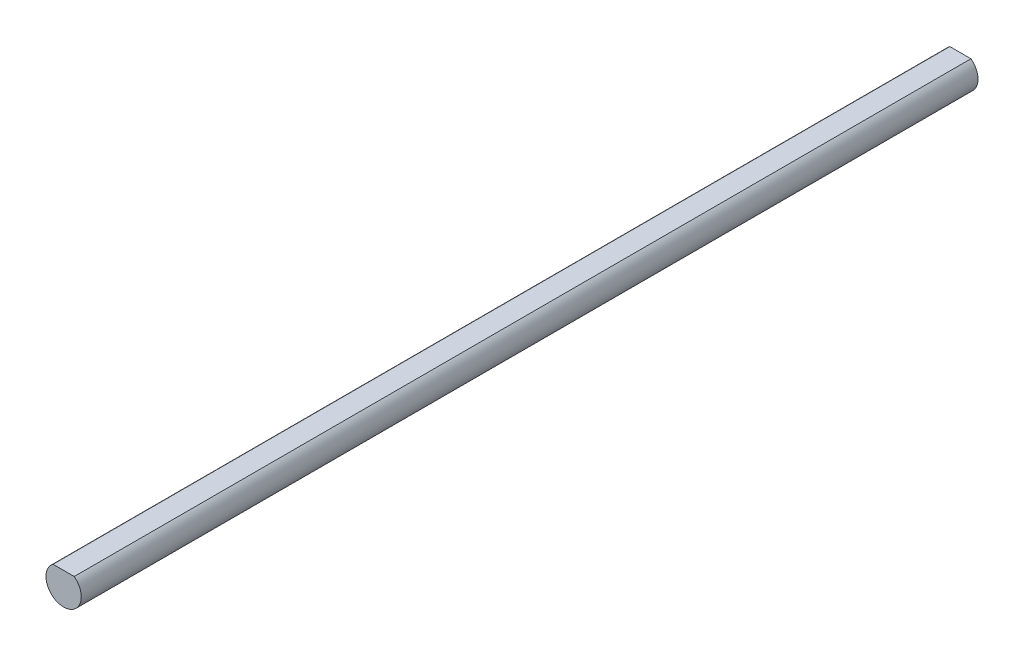
ISO-10303-21;
HEADER;
FILE_DESCRIPTION(('STEP AP214'),'2;1');
FILE_NAME('part.step','',(''),(''),'','','');
FILE_SCHEMA(('AUTOMOTIVE_DESIGN { 1 0 10303 214 1 1 1 1 }'));
ENDSEC;
DATA;
#1=APPLICATION_CONTEXT('core data for automotive mechanical design processes');
#2=APPLICATION_PROTOCOL_DEFINITION('international standard','automotive_design',2000,#1);
#3=PRODUCT_CONTEXT('',#1,'mechanical');
#4=PRODUCT('Part','Part','',(#3));
#5=PRODUCT_RELATED_PRODUCT_CATEGORY('part','',(#4));
#6=PRODUCT_DEFINITION_FORMATION('','',#4);
#7=PRODUCT_DEFINITION_CONTEXT('part definition',#1,'design');
#8=PRODUCT_DEFINITION('design','',#6,#7);
#9=PRODUCT_DEFINITION_SHAPE('','',#8);
#10=(LENGTH_UNIT() NAMED_UNIT(*) SI_UNIT(.MILLI.,.METRE.));
#11=(NAMED_UNIT(*) PLANE_ANGLE_UNIT() SI_UNIT($,.RADIAN.));
#12=(NAMED_UNIT(*) SI_UNIT($,.STERADIAN.) SOLID_ANGLE_UNIT());
#13=UNCERTAINTY_MEASURE_WITH_UNIT(LENGTH_MEASURE(1.E-05),#10,'distance_accuracy_value','');
#14=(GEOMETRIC_REPRESENTATION_CONTEXT(3) GLOBAL_UNCERTAINTY_ASSIGNED_CONTEXT((#13)) GLOBAL_UNIT_ASSIGNED_CONTEXT((#10,
#11,#12)) REPRESENTATION_CONTEXT('',''));
#15=CARTESIAN_POINT('',(0.,0.,0.));
#16=DIRECTION('',(0.,0.,1.));
#17=DIRECTION('',(1.,0.,0.));
#18=AXIS2_PLACEMENT_3D('',#15,#16,#17);
#19=CARTESIAN_POINT('',(0.,0.,127.));
#20=DIRECTION('',(0.,0.,-1.));
#21=DIRECTION('',(-1.,0.,0.));
#22=AXIS2_PLACEMENT_3D('',#19,#20,#21);
#23=CYLINDRICAL_SURFACE('',#22,2.5);
#24=CARTESIAN_POINT('',(0.,0.,0.));
#25=DIRECTION('',(0.,0.,1.));
#26=DIRECTION('',(1.,0.,0.));
#27=AXIS2_PLACEMENT_3D('',#24,#25,#26);
#28=CIRCLE('',#27,2.5);
#29=CARTESIAN_POINT('',(-1.5,2.,0.));
#30=VERTEX_POINT('',#29);
#31=CARTESIAN_POINT('',(1.5,2.,0.));
#32=VERTEX_POINT('',#31);
#33=EDGE_CURVE('E78',#30,#32,#28,.T.);
#34=ORIENTED_EDGE('',*,*,#33,.T.);
#35=DIRECTION('',(0.,0.,-1.));
#36=VECTOR('',#35,1.);
#37=CARTESIAN_POINT('',(1.5,2.,127.));
#38=LINE('',#37,#36);
#39=CARTESIAN_POINT('',(1.5,2.,127.));
#40=VERTEX_POINT('',#39);
#41=EDGE_CURVE('E11',#40,#32,#38,.T.);
#42=ORIENTED_EDGE('',*,*,#41,.F.);
#43=CARTESIAN_POINT('',(0.,0.,127.));
#44=DIRECTION('',(0.,0.,1.));
#45=DIRECTION('',(1.,0.,0.));
#46=AXIS2_PLACEMENT_3D('',#43,#44,#45);
#47=CIRCLE('',#46,2.5);
#48=CARTESIAN_POINT('',(-1.5,2.,127.));
#49=VERTEX_POINT('',#48);
#50=EDGE_CURVE('E77',#49,#40,#47,.T.);
#51=ORIENTED_EDGE('',*,*,#50,.F.);
#52=DIRECTION('',(0.,0.,-1.));
#53=VECTOR('',#52,1.);
#54=CARTESIAN_POINT('',(-1.5,2.,127.));
#55=LINE('',#54,#53);
#56=EDGE_CURVE('E54',#49,#30,#55,.T.);
#57=ORIENTED_EDGE('',*,*,#56,.T.);
#58=EDGE_LOOP('',(#34,#42,#51,#57));
#59=FACE_BOUND('',#58,.T.);
#60=ADVANCED_FACE('F45',(#59),#23,.T.);
#61=CARTESIAN_POINT('',(-1.5,2.,127.));
#62=DIRECTION('',(0.,-1.,0.));
#63=DIRECTION('',(1.,0.,0.));
#64=AXIS2_PLACEMENT_3D('',#61,#62,#63);
#65=PLANE('',#64);
#66=DIRECTION('',(-1.,0.,0.));
#67=VECTOR('',#66,1.);
#68=CARTESIAN_POINT('',(-1.5,2.,0.));
#69=LINE('',#68,#67);
#70=EDGE_CURVE('E69',#32,#30,#69,.T.);
#71=ORIENTED_EDGE('',*,*,#70,.T.);
#72=ORIENTED_EDGE('',*,*,#56,.F.);
#73=DIRECTION('',(-1.,0.,0.));
#74=VECTOR('',#73,1.);
#75=CARTESIAN_POINT('',(-1.5,2.,127.));
#76=LINE('',#75,#74);
#77=EDGE_CURVE('E61',#40,#49,#76,.T.);
#78=ORIENTED_EDGE('',*,*,#77,.F.);
#79=ORIENTED_EDGE('',*,*,#41,.T.);
#80=EDGE_LOOP('',(#71,#72,#78,#79));
#81=FACE_BOUND('',#80,.T.);
#82=ADVANCED_FACE('F72',(#81),#65,.F.);
#83=CARTESIAN_POINT('',(0.,0.,127.));
#84=DIRECTION('',(0.,0.,1.));
#85=DIRECTION('',(1.,0.,0.));
#86=AXIS2_PLACEMENT_3D('',#83,#84,#85);
#87=PLANE('',#86);
#88=ORIENTED_EDGE('',*,*,#50,.T.);
#89=ORIENTED_EDGE('',*,*,#77,.T.);
#90=EDGE_LOOP('',(#88,#89));
#91=FACE_BOUND('',#90,.T.);
#92=ADVANCED_FACE('F89',(#91),#87,.T.);
#93=CARTESIAN_POINT('',(0.,0.,0.));
#94=DIRECTION('',(0.,0.,1.));
#95=DIRECTION('',(1.,0.,0.));
#96=AXIS2_PLACEMENT_3D('',#93,#94,#95);
#97=PLANE('',#96);
#98=ORIENTED_EDGE('',*,*,#33,.F.);
#99=ORIENTED_EDGE('',*,*,#70,.F.);
#100=EDGE_LOOP('',(#98,#99));
#101=FACE_BOUND('',#100,.T.);
#102=ADVANCED_FACE('F82',(#101),#97,.F.);
#103=CLOSED_SHELL('',(#60,#82,#92,#102));
#104=MANIFOLD_SOLID_BREP('B2',#103);
#105=ADVANCED_BREP_SHAPE_REPRESENTATION('',(#18,#104),#14);
#106=SHAPE_DEFINITION_REPRESENTATION(#9,#105);
ENDSEC;
END-ISO-10303-21;
